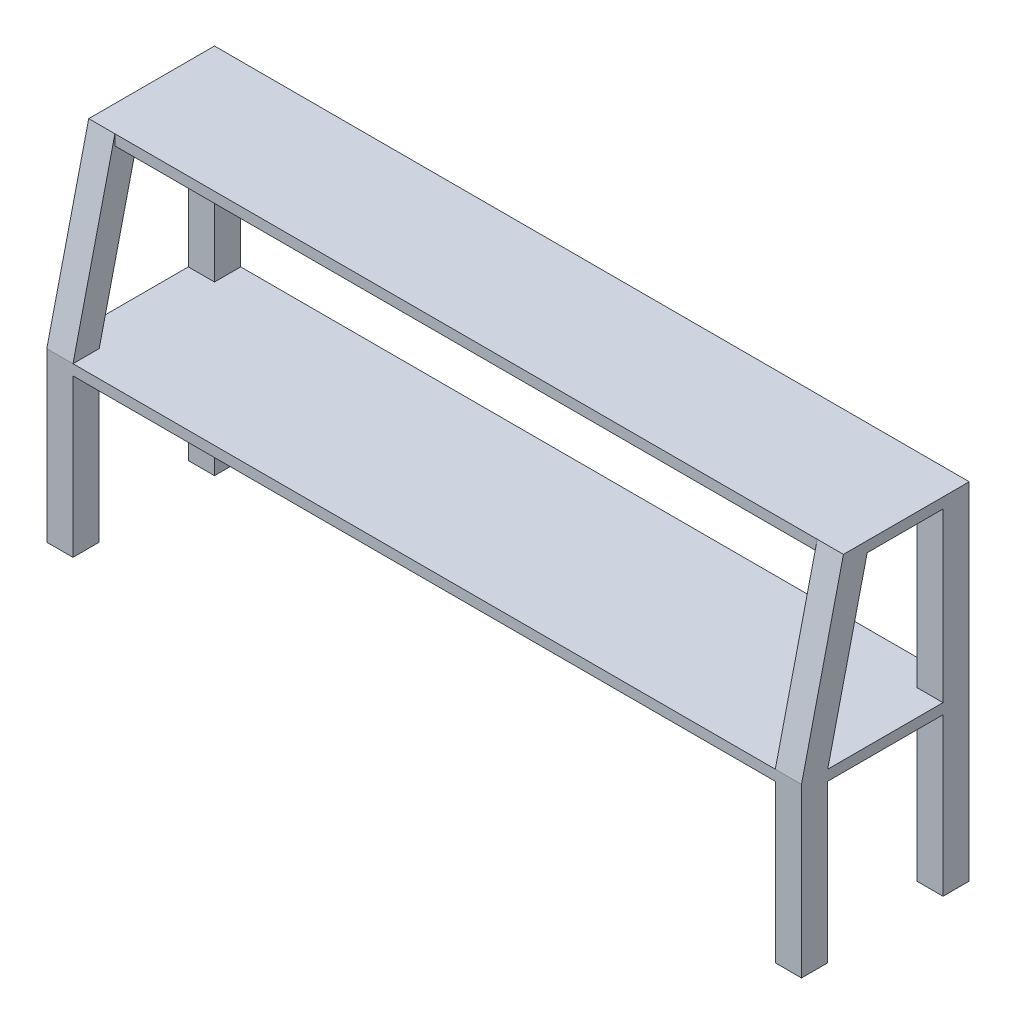
ISO-10303-21;
HEADER;
FILE_DESCRIPTION(('STEP AP214'),'2;1');
FILE_NAME('part.step','',(''),(''),'','','');
FILE_SCHEMA(('AUTOMOTIVE_DESIGN { 1 0 10303 214 1 1 1 1 }'));
ENDSEC;
DATA;
#1=APPLICATION_CONTEXT('core data for automotive mechanical design processes');
#2=APPLICATION_PROTOCOL_DEFINITION('international standard','automotive_design',2000,#1);
#3=PRODUCT_CONTEXT('',#1,'mechanical');
#4=PRODUCT('Part','Part','',(#3));
#5=PRODUCT_RELATED_PRODUCT_CATEGORY('part','',(#4));
#6=PRODUCT_DEFINITION_FORMATION('','',#4);
#7=PRODUCT_DEFINITION_CONTEXT('part definition',#1,'design');
#8=PRODUCT_DEFINITION('design','',#6,#7);
#9=PRODUCT_DEFINITION_SHAPE('','',#8);
#10=(LENGTH_UNIT() NAMED_UNIT(*) SI_UNIT(.MILLI.,.METRE.));
#11=(NAMED_UNIT(*) PLANE_ANGLE_UNIT() SI_UNIT($,.RADIAN.));
#12=(NAMED_UNIT(*) SI_UNIT($,.STERADIAN.) SOLID_ANGLE_UNIT());
#13=UNCERTAINTY_MEASURE_WITH_UNIT(LENGTH_MEASURE(1.E-05),#10,'distance_accuracy_value','');
#14=(GEOMETRIC_REPRESENTATION_CONTEXT(3) GLOBAL_UNCERTAINTY_ASSIGNED_CONTEXT((#13)) GLOBAL_UNIT_ASSIGNED_CONTEXT((#10,
#11,#12)) REPRESENTATION_CONTEXT('',''));
#15=CARTESIAN_POINT('',(0.,0.,0.));
#16=DIRECTION('',(0.,0.,1.));
#17=DIRECTION('',(1.,0.,0.));
#18=AXIS2_PLACEMENT_3D('',#15,#16,#17);
#19=CARTESIAN_POINT('',(0.,12.7,0.));
#20=DIRECTION('',(0.,-1.,0.));
#21=DIRECTION('',(0.,0.,-1.));
#22=AXIS2_PLACEMENT_3D('',#19,#20,#21);
#23=PLANE('',#22);
#24=DIRECTION('',(-1.,0.,0.));
#25=VECTOR('',#24,1.);
#26=CARTESIAN_POINT('',(31.75,12.7,-31.75));
#27=LINE('',#26,#25);
#28=CARTESIAN_POINT('',(31.75,12.7,-31.75));
#29=VERTEX_POINT('',#28);
#30=CARTESIAN_POINT('',(0.,12.7,-31.75));
#31=VERTEX_POINT('',#30);
#32=EDGE_CURVE('E61',#29,#31,#27,.T.);
#33=ORIENTED_EDGE('',*,*,#32,.F.);
#34=DIRECTION('',(0.,0.,1.));
#35=VECTOR('',#34,1.);
#36=CARTESIAN_POINT('',(31.75,12.7,0.));
#37=LINE('',#36,#35);
#38=CARTESIAN_POINT('',(31.75,12.7,0.));
#39=VERTEX_POINT('',#38);
#40=EDGE_CURVE('E254',#29,#39,#37,.T.);
#41=ORIENTED_EDGE('',*,*,#40,.T.);
#42=DIRECTION('',(1.,0.,0.));
#43=VECTOR('',#42,1.);
#44=CARTESIAN_POINT('',(0.,12.7,0.));
#45=LINE('',#44,#43);
#46=CARTESIAN_POINT('',(882.65,12.7,0.));
#47=VERTEX_POINT('',#46);
#48=EDGE_CURVE('E243',#39,#47,#45,.T.);
#49=ORIENTED_EDGE('',*,*,#48,.T.);
#50=DIRECTION('',(0.,0.,-1.));
#51=VECTOR('',#50,1.);
#52=CARTESIAN_POINT('',(882.65,12.7,0.));
#53=LINE('',#52,#51);
#54=CARTESIAN_POINT('',(882.65,12.7,-31.75));
#55=VERTEX_POINT('',#54);
#56=EDGE_CURVE('E456',#47,#55,#53,.T.);
#57=ORIENTED_EDGE('',*,*,#56,.T.);
#58=DIRECTION('',(1.,0.,0.));
#59=VECTOR('',#58,1.);
#60=CARTESIAN_POINT('',(882.65,12.7,-31.75));
#61=LINE('',#60,#59);
#62=CARTESIAN_POINT('',(914.4,12.7,-31.75));
#63=VERTEX_POINT('',#62);
#64=EDGE_CURVE('E410',#55,#63,#61,.T.);
#65=ORIENTED_EDGE('',*,*,#64,.T.);
#66=DIRECTION('',(0.,0.,-1.));
#67=VECTOR('',#66,1.);
#68=CARTESIAN_POINT('',(914.4,12.7,0.));
#69=LINE('',#68,#67);
#70=CARTESIAN_POINT('',(914.4,12.7,-171.45));
#71=VERTEX_POINT('',#70);
#72=EDGE_CURVE('E278',#63,#71,#69,.T.);
#73=ORIENTED_EDGE('',*,*,#72,.T.);
#74=DIRECTION('',(-1.,0.,0.));
#75=VECTOR('',#74,1.);
#76=CARTESIAN_POINT('',(0.,12.7,-171.45));
#77=LINE('',#76,#75);
#78=CARTESIAN_POINT('',(882.65,12.7,-171.45));
#79=VERTEX_POINT('',#78);
#80=EDGE_CURVE('E293',#71,#79,#77,.T.);
#81=ORIENTED_EDGE('',*,*,#80,.T.);
#82=DIRECTION('',(0.,0.,-1.));
#83=VECTOR('',#82,1.);
#84=CARTESIAN_POINT('',(882.65,12.7,0.));
#85=LINE('',#84,#83);
#86=CARTESIAN_POINT('',(882.65,12.7,-203.2));
#87=VERTEX_POINT('',#86);
#88=EDGE_CURVE('E512',#79,#87,#85,.T.);
#89=ORIENTED_EDGE('',*,*,#88,.T.);
#90=DIRECTION('',(-1.,0.,0.));
#91=VECTOR('',#90,1.);
#92=CARTESIAN_POINT('',(0.,12.7,-203.2));
#93=LINE('',#92,#91);
#94=CARTESIAN_POINT('',(31.75,12.7,-203.2));
#95=VERTEX_POINT('',#94);
#96=EDGE_CURVE('E280',#87,#95,#93,.T.);
#97=ORIENTED_EDGE('',*,*,#96,.T.);
#98=DIRECTION('',(0.,0.,1.));
#99=VECTOR('',#98,1.);
#100=CARTESIAN_POINT('',(31.75,12.7,0.));
#101=LINE('',#100,#99);
#102=CARTESIAN_POINT('',(31.75,12.7,-171.45));
#103=VERTEX_POINT('',#102);
#104=EDGE_CURVE('E390',#95,#103,#101,.T.);
#105=ORIENTED_EDGE('',*,*,#104,.T.);
#106=DIRECTION('',(1.,0.,0.));
#107=VECTOR('',#106,1.);
#108=CARTESIAN_POINT('',(0.,12.7,-171.45));
#109=LINE('',#108,#107);
#110=CARTESIAN_POINT('',(0.,12.7,-171.45));
#111=VERTEX_POINT('',#110);
#112=EDGE_CURVE('E356',#111,#103,#109,.T.);
#113=ORIENTED_EDGE('',*,*,#112,.F.);
#114=DIRECTION('',(0.,0.,1.));
#115=VECTOR('',#114,1.);
#116=CARTESIAN_POINT('',(0.,12.7,0.));
#117=LINE('',#116,#115);
#118=EDGE_CURVE('E252',#111,#31,#117,.T.);
#119=ORIENTED_EDGE('',*,*,#118,.T.);
#120=EDGE_LOOP('',(#33,#41,#49,#57,#65,#73,#81,#89,#97,#105,#113,#119));
#121=FACE_BOUND('',#120,.T.);
#122=ADVANCED_FACE('F45',(#121),#23,.F.);
#123=CARTESIAN_POINT('',(0.,0.,0.));
#124=DIRECTION('',(0.,-1.,0.));
#125=DIRECTION('',(0.,0.,-1.));
#126=AXIS2_PLACEMENT_3D('',#123,#124,#125);
#127=PLANE('',#126);
#128=DIRECTION('',(0.,0.,1.));
#129=VECTOR('',#128,1.);
#130=CARTESIAN_POINT('',(31.75,0.,0.));
#131=LINE('',#130,#129);
#132=CARTESIAN_POINT('',(31.75,0.,-31.75));
#133=VERTEX_POINT('',#132);
#134=CARTESIAN_POINT('',(31.75,0.,0.));
#135=VERTEX_POINT('',#134);
#136=EDGE_CURVE('E261',#133,#135,#131,.T.);
#137=ORIENTED_EDGE('',*,*,#136,.F.);
#138=DIRECTION('',(-1.,0.,0.));
#139=VECTOR('',#138,1.);
#140=CARTESIAN_POINT('',(0.,0.,-31.75));
#141=LINE('',#140,#139);
#142=CARTESIAN_POINT('',(0.,0.,-31.75));
#143=VERTEX_POINT('',#142);
#144=EDGE_CURVE('E374',#133,#143,#141,.T.);
#145=ORIENTED_EDGE('',*,*,#144,.T.);
#146=DIRECTION('',(0.,0.,1.));
#147=VECTOR('',#146,1.);
#148=CARTESIAN_POINT('',(0.,0.,0.));
#149=LINE('',#148,#147);
#150=CARTESIAN_POINT('',(0.,0.,-171.45));
#151=VERTEX_POINT('',#150);
#152=EDGE_CURVE('E288',#151,#143,#149,.T.);
#153=ORIENTED_EDGE('',*,*,#152,.F.);
#154=DIRECTION('',(1.,0.,0.));
#155=VECTOR('',#154,1.);
#156=CARTESIAN_POINT('',(0.,0.,-171.45));
#157=LINE('',#156,#155);
#158=CARTESIAN_POINT('',(31.75,0.,-171.45));
#159=VERTEX_POINT('',#158);
#160=EDGE_CURVE('E393',#151,#159,#157,.T.);
#161=ORIENTED_EDGE('',*,*,#160,.T.);
#162=DIRECTION('',(0.,0.,1.));
#163=VECTOR('',#162,1.);
#164=CARTESIAN_POINT('',(31.75,0.,0.));
#165=LINE('',#164,#163);
#166=CARTESIAN_POINT('',(31.75,0.,-203.2));
#167=VERTEX_POINT('',#166);
#168=EDGE_CURVE('E387',#167,#159,#165,.T.);
#169=ORIENTED_EDGE('',*,*,#168,.F.);
#170=DIRECTION('',(-1.,0.,0.));
#171=VECTOR('',#170,1.);
#172=CARTESIAN_POINT('',(0.,0.,-203.2));
#173=LINE('',#172,#171);
#174=CARTESIAN_POINT('',(882.65,0.,-203.2));
#175=VERTEX_POINT('',#174);
#176=EDGE_CURVE('E299',#175,#167,#173,.T.);
#177=ORIENTED_EDGE('',*,*,#176,.F.);
#178=DIRECTION('',(0.,0.,-1.));
#179=VECTOR('',#178,1.);
#180=CARTESIAN_POINT('',(882.65,0.,0.));
#181=LINE('',#180,#179);
#182=CARTESIAN_POINT('',(882.65,0.,-171.45));
#183=VERTEX_POINT('',#182);
#184=EDGE_CURVE('E314',#183,#175,#181,.T.);
#185=ORIENTED_EDGE('',*,*,#184,.F.);
#186=DIRECTION('',(-1.,0.,0.));
#187=VECTOR('',#186,1.);
#188=CARTESIAN_POINT('',(0.,0.,-171.45));
#189=LINE('',#188,#187);
#190=CARTESIAN_POINT('',(914.4,0.,-171.45));
#191=VERTEX_POINT('',#190);
#192=EDGE_CURVE('E317',#191,#183,#189,.T.);
#193=ORIENTED_EDGE('',*,*,#192,.F.);
#194=DIRECTION('',(0.,0.,-1.));
#195=VECTOR('',#194,1.);
#196=CARTESIAN_POINT('',(914.4,0.,0.));
#197=LINE('',#196,#195);
#198=CARTESIAN_POINT('',(914.4,0.,-31.75));
#199=VERTEX_POINT('',#198);
#200=EDGE_CURVE('E296',#199,#191,#197,.T.);
#201=ORIENTED_EDGE('',*,*,#200,.F.);
#202=DIRECTION('',(1.,0.,0.));
#203=VECTOR('',#202,1.);
#204=CARTESIAN_POINT('',(0.,0.,-31.75));
#205=LINE('',#204,#203);
#206=CARTESIAN_POINT('',(882.65,0.,-31.75));
#207=VERTEX_POINT('',#206);
#208=EDGE_CURVE('E331',#207,#199,#205,.T.);
#209=ORIENTED_EDGE('',*,*,#208,.F.);
#210=DIRECTION('',(0.,0.,-1.));
#211=VECTOR('',#210,1.);
#212=CARTESIAN_POINT('',(882.65,0.,0.));
#213=LINE('',#212,#211);
#214=CARTESIAN_POINT('',(882.65,0.,0.));
#215=VERTEX_POINT('',#214);
#216=EDGE_CURVE('E453',#215,#207,#213,.T.);
#217=ORIENTED_EDGE('',*,*,#216,.F.);
#218=DIRECTION('',(1.,0.,0.));
#219=VECTOR('',#218,1.);
#220=CARTESIAN_POINT('',(0.,0.,0.));
#221=LINE('',#220,#219);
#222=EDGE_CURVE('E292',#135,#215,#221,.T.);
#223=ORIENTED_EDGE('',*,*,#222,.F.);
#224=EDGE_LOOP('',(#137,#145,#153,#161,#169,#177,#185,#193,#201,#209,#217,#223));
#225=FACE_BOUND('',#224,.T.);
#226=ADVANCED_FACE('F571',(#225),#127,.T.);
#227=CARTESIAN_POINT('',(0.,215.9,0.));
#228=DIRECTION('',(0.,-1.,0.));
#229=DIRECTION('',(0.,0.,-1.));
#230=AXIS2_PLACEMENT_3D('',#227,#228,#229);
#231=PLANE('',#230);
#232=DIRECTION('',(0.,0.,1.));
#233=VECTOR('',#232,1.);
#234=CARTESIAN_POINT('',(31.75,215.9,0.));
#235=LINE('',#234,#233);
#236=CARTESIAN_POINT('',(31.75,215.9,-79.5617647058823));
#237=VERTEX_POINT('',#236);
#238=CARTESIAN_POINT('',(31.7500000000002,215.9,-50.7999999999999));
#239=VERTEX_POINT('',#238);
#240=EDGE_CURVE('E69',#237,#239,#235,.T.);
#241=ORIENTED_EDGE('',*,*,#240,.F.);
#242=DIRECTION('',(-1.,0.,0.));
#243=VECTOR('',#242,1.);
#244=CARTESIAN_POINT('',(0.,215.9,-79.5617647058823));
#245=LINE('',#244,#243);
#246=CARTESIAN_POINT('',(0.,215.9,-79.5617647058823));
#247=VERTEX_POINT('',#246);
#248=EDGE_CURVE('E260',#237,#247,#245,.T.);
#249=ORIENTED_EDGE('',*,*,#248,.T.);
#250=DIRECTION('',(0.,0.,1.));
#251=VECTOR('',#250,1.);
#252=CARTESIAN_POINT('',(0.,215.9,-203.2));
#253=LINE('',#252,#251);
#254=CARTESIAN_POINT('',(0.,215.9,-171.45));
#255=VERTEX_POINT('',#254);
#256=EDGE_CURVE('E346',#255,#247,#253,.T.);
#257=ORIENTED_EDGE('',*,*,#256,.F.);
#258=DIRECTION('',(1.,0.,0.));
#259=VECTOR('',#258,1.);
#260=CARTESIAN_POINT('',(0.,215.9,-171.45));
#261=LINE('',#260,#259);
#262=CARTESIAN_POINT('',(31.75,215.9,-171.45));
#263=VERTEX_POINT('',#262);
#264=EDGE_CURVE('E54',#255,#263,#261,.T.);
#265=ORIENTED_EDGE('',*,*,#264,.T.);
#266=DIRECTION('',(0.,0.,1.));
#267=VECTOR('',#266,1.);
#268=CARTESIAN_POINT('',(31.75,215.9,0.));
#269=LINE('',#268,#267);
#270=CARTESIAN_POINT('',(31.75,215.9,-203.2));
#271=VERTEX_POINT('',#270);
#272=EDGE_CURVE('E335',#271,#263,#269,.T.);
#273=ORIENTED_EDGE('',*,*,#272,.F.);
#274=DIRECTION('',(-1.,0.,0.));
#275=VECTOR('',#274,1.);
#276=CARTESIAN_POINT('',(914.4,215.9,-203.2));
#277=LINE('',#276,#275);
#278=CARTESIAN_POINT('',(882.65,215.9,-203.2));
#279=VERTEX_POINT('',#278);
#280=EDGE_CURVE('E472',#279,#271,#277,.T.);
#281=ORIENTED_EDGE('',*,*,#280,.F.);
#282=DIRECTION('',(0.,0.,1.));
#283=VECTOR('',#282,1.);
#284=CARTESIAN_POINT('',(882.65,215.9,0.));
#285=LINE('',#284,#283);
#286=CARTESIAN_POINT('',(882.65,215.9,-171.45));
#287=VERTEX_POINT('',#286);
#288=EDGE_CURVE('E320',#279,#287,#285,.T.);
#289=ORIENTED_EDGE('',*,*,#288,.T.);
#290=DIRECTION('',(1.,0.,0.));
#291=VECTOR('',#290,1.);
#292=CARTESIAN_POINT('',(882.65,215.9,-171.45));
#293=LINE('',#292,#291);
#294=CARTESIAN_POINT('',(914.4,215.9,-171.45));
#295=VERTEX_POINT('',#294);
#296=EDGE_CURVE('E469',#287,#295,#293,.T.);
#297=ORIENTED_EDGE('',*,*,#296,.T.);
#298=DIRECTION('',(0.,0.,-1.));
#299=VECTOR('',#298,1.);
#300=CARTESIAN_POINT('',(914.4,215.9,-203.2));
#301=LINE('',#300,#299);
#302=CARTESIAN_POINT('',(914.4,215.9,-79.5617647058824));
#303=VERTEX_POINT('',#302);
#304=EDGE_CURVE('E459',#303,#295,#301,.T.);
#305=ORIENTED_EDGE('',*,*,#304,.F.);
#306=DIRECTION('',(1.,0.,0.));
#307=VECTOR('',#306,1.);
#308=CARTESIAN_POINT('',(0.,215.9,-79.5617647058823));
#309=LINE('',#308,#307);
#310=CARTESIAN_POINT('',(882.65,215.9,-79.5617647058823));
#311=VERTEX_POINT('',#310);
#312=EDGE_CURVE('E327',#311,#303,#309,.T.);
#313=ORIENTED_EDGE('',*,*,#312,.F.);
#314=DIRECTION('',(0.,0.,-1.));
#315=VECTOR('',#314,1.);
#316=CARTESIAN_POINT('',(882.65,215.9,0.));
#317=LINE('',#316,#315);
#318=CARTESIAN_POINT('',(882.65,215.9,-50.7999999999999));
#319=VERTEX_POINT('',#318);
#320=EDGE_CURVE('E324',#319,#311,#317,.T.);
#321=ORIENTED_EDGE('',*,*,#320,.F.);
#322=DIRECTION('',(1.,0.,0.));
#323=VECTOR('',#322,1.);
#324=CARTESIAN_POINT('',(914.4,215.9,-50.8));
#325=LINE('',#324,#323);
#326=EDGE_CURVE('E464',#239,#319,#325,.T.);
#327=ORIENTED_EDGE('',*,*,#326,.F.);
#328=EDGE_LOOP('',(#241,#249,#257,#265,#273,#281,#289,#297,#305,#313,#321,#327));
#329=FACE_BOUND('',#328,.T.);
#330=ADVANCED_FACE('F342',(#329),#231,.T.);
#331=CARTESIAN_POINT('',(0.,12.7,0.));
#332=DIRECTION('',(1.,0.,0.));
#333=DIRECTION('',(0.,0.,-1.));
#334=AXIS2_PLACEMENT_3D('',#331,#332,#333);
#335=PLANE('',#334);
#336=DIRECTION('',(0.,-1.,0.));
#337=VECTOR('',#336,1.);
#338=CARTESIAN_POINT('',(0.,12.7,0.));
#339=LINE('',#338,#337);
#340=CARTESIAN_POINT('',(0.,12.7,0.));
#341=VERTEX_POINT('',#340);
#342=CARTESIAN_POINT('',(0.,-190.5,0.));
#343=VERTEX_POINT('',#342);
#344=EDGE_CURVE('E311',#341,#343,#339,.T.);
#345=ORIENTED_EDGE('',*,*,#344,.F.);
#346=DIRECTION('',(0.,-0.973417168333576,0.229039333725547));
#347=VECTOR('',#346,1.);
#348=CARTESIAN_POINT('',(0.,12.7,0.));
#349=LINE('',#348,#347);
#350=CARTESIAN_POINT('',(0.,228.6,-50.7999999999999));
#351=VERTEX_POINT('',#350);
#352=EDGE_CURVE('E276',#351,#341,#349,.T.);
#353=ORIENTED_EDGE('',*,*,#352,.F.);
#354=DIRECTION('',(0.,0.,1.));
#355=VECTOR('',#354,1.);
#356=CARTESIAN_POINT('',(0.,228.6,-203.2));
#357=LINE('',#356,#355);
#358=CARTESIAN_POINT('',(0.,228.6,-203.2));
#359=VERTEX_POINT('',#358);
#360=EDGE_CURVE('E460',#359,#351,#357,.T.);
#361=ORIENTED_EDGE('',*,*,#360,.F.);
#362=DIRECTION('',(0.,-1.,0.));
#363=VECTOR('',#362,1.);
#364=CARTESIAN_POINT('',(0.,12.7,-203.2));
#365=LINE('',#364,#363);
#366=CARTESIAN_POINT('',(0.,-190.5,-203.2));
#367=VERTEX_POINT('',#366);
#368=EDGE_CURVE('E287',#359,#367,#365,.T.);
#369=ORIENTED_EDGE('',*,*,#368,.T.);
#370=DIRECTION('',(0.,0.,-1.));
#371=VECTOR('',#370,1.);
#372=CARTESIAN_POINT('',(0.,-190.5,0.));
#373=LINE('',#372,#371);
#374=CARTESIAN_POINT('',(0.,-190.5,-171.45));
#375=VERTEX_POINT('',#374);
#376=EDGE_CURVE('E375',#375,#367,#373,.T.);
#377=ORIENTED_EDGE('',*,*,#376,.F.);
#378=DIRECTION('',(0.,-1.,0.));
#379=VECTOR('',#378,1.);
#380=CARTESIAN_POINT('',(0.,12.7,-171.45));
#381=LINE('',#380,#379);
#382=EDGE_CURVE('E371',#151,#375,#381,.T.);
#383=ORIENTED_EDGE('',*,*,#382,.F.);
#384=ORIENTED_EDGE('',*,*,#152,.T.);
#385=DIRECTION('',(0.,1.,0.));
#386=VECTOR('',#385,1.);
#387=CARTESIAN_POINT('',(0.,12.7,-31.75));
#388=LINE('',#387,#386);
#389=CARTESIAN_POINT('',(0.,-190.5,-31.75));
#390=VERTEX_POINT('',#389);
#391=EDGE_CURVE('E580',#390,#143,#388,.T.);
#392=ORIENTED_EDGE('',*,*,#391,.F.);
#393=DIRECTION('',(0.,0.,-1.));
#394=VECTOR('',#393,1.);
#395=CARTESIAN_POINT('',(0.,-190.5,0.));
#396=LINE('',#395,#394);
#397=EDGE_CURVE('E641',#343,#390,#396,.T.);
#398=ORIENTED_EDGE('',*,*,#397,.F.);
#399=EDGE_LOOP('',(#345,#353,#361,#369,#377,#383,#384,#392,#398));
#400=FACE_BOUND('',#399,.T.);
#401=DIRECTION('',(0.,0.973417168333576,-0.229039333725547));
#402=VECTOR('',#401,1.);
#403=CARTESIAN_POINT('',(0.,5.62131147540984,-30.0844262295082));
#404=LINE('',#403,#402);
#405=EDGE_CURVE('E271',#31,#247,#404,.T.);
#406=ORIENTED_EDGE('',*,*,#405,.F.);
#407=ORIENTED_EDGE('',*,*,#118,.F.);
#408=EDGE_CURVE('E352',#255,#111,#381,.T.);
#409=ORIENTED_EDGE('',*,*,#408,.F.);
#410=ORIENTED_EDGE('',*,*,#256,.T.);
#411=EDGE_LOOP('',(#406,#407,#409,#410));
#412=FACE_BOUND('',#411,.T.);
#413=ADVANCED_FACE('F47',(#400,#412),#335,.F.);
#414=CARTESIAN_POINT('',(0.,12.7,0.));
#415=DIRECTION('',(0.,0.,-1.));
#416=DIRECTION('',(-1.,0.,0.));
#417=AXIS2_PLACEMENT_3D('',#414,#415,#416);
#418=PLANE('',#417);
#419=ORIENTED_EDGE('',*,*,#48,.F.);
#420=EDGE_CURVE('E246',#341,#39,#45,.T.);
#421=ORIENTED_EDGE('',*,*,#420,.F.);
#422=ORIENTED_EDGE('',*,*,#344,.T.);
#423=DIRECTION('',(-1.,0.,0.));
#424=VECTOR('',#423,1.);
#425=CARTESIAN_POINT('',(31.75,-190.5,0.));
#426=LINE('',#425,#424);
#427=CARTESIAN_POINT('',(31.75,-190.5,0.));
#428=VERTEX_POINT('',#427);
#429=EDGE_CURVE('E555',#428,#343,#426,.T.);
#430=ORIENTED_EDGE('',*,*,#429,.F.);
#431=DIRECTION('',(0.,-1.,0.));
#432=VECTOR('',#431,1.);
#433=CARTESIAN_POINT('',(31.75,12.7,0.));
#434=LINE('',#433,#432);
#435=EDGE_CURVE('E270',#135,#428,#434,.T.);
#436=ORIENTED_EDGE('',*,*,#435,.F.);
#437=ORIENTED_EDGE('',*,*,#222,.T.);
#438=DIRECTION('',(0.,-1.,0.));
#439=VECTOR('',#438,1.);
#440=CARTESIAN_POINT('',(882.65,12.7,0.));
#441=LINE('',#440,#439);
#442=CARTESIAN_POINT('',(882.65,-190.5,0.));
#443=VERTEX_POINT('',#442);
#444=EDGE_CURVE('E444',#215,#443,#441,.T.);
#445=ORIENTED_EDGE('',*,*,#444,.T.);
#446=DIRECTION('',(1.,0.,0.));
#447=VECTOR('',#446,1.);
#448=CARTESIAN_POINT('',(882.65,-190.5,0.));
#449=LINE('',#448,#447);
#450=CARTESIAN_POINT('',(914.4,-190.5,0.));
#451=VERTEX_POINT('',#450);
#452=EDGE_CURVE('E403',#443,#451,#449,.T.);
#453=ORIENTED_EDGE('',*,*,#452,.T.);
#454=DIRECTION('',(0.,-1.,0.));
#455=VECTOR('',#454,1.);
#456=CARTESIAN_POINT('',(914.4,12.7,0.));
#457=LINE('',#456,#455);
#458=CARTESIAN_POINT('',(914.4,12.7,0.));
#459=VERTEX_POINT('',#458);
#460=EDGE_CURVE('E308',#459,#451,#457,.T.);
#461=ORIENTED_EDGE('',*,*,#460,.F.);
#462=DIRECTION('',(1.,0.,0.));
#463=VECTOR('',#462,1.);
#464=CARTESIAN_POINT('',(882.65,12.7,0.));
#465=LINE('',#464,#463);
#466=EDGE_CURVE('E249',#47,#459,#465,.T.);
#467=ORIENTED_EDGE('',*,*,#466,.F.);
#468=EDGE_LOOP('',(#419,#421,#422,#430,#436,#437,#445,#453,#461,#467));
#469=FACE_BOUND('',#468,.T.);
#470=ADVANCED_FACE('F244',(#469),#418,.F.);
#471=CARTESIAN_POINT('',(914.4,12.7,0.));
#472=DIRECTION('',(-1.,0.,0.));
#473=DIRECTION('',(0.,0.,1.));
#474=AXIS2_PLACEMENT_3D('',#471,#472,#473);
#475=PLANE('',#474);
#476=DIRECTION('',(0.,0.973417168333576,-0.229039333725547));
#477=VECTOR('',#476,1.);
#478=CARTESIAN_POINT('',(914.4,228.6,-82.55));
#479=LINE('',#478,#477);
#480=EDGE_CURVE('E417',#63,#303,#479,.T.);
#481=ORIENTED_EDGE('',*,*,#480,.T.);
#482=ORIENTED_EDGE('',*,*,#304,.T.);
#483=DIRECTION('',(0.,-1.,0.));
#484=VECTOR('',#483,1.);
#485=CARTESIAN_POINT('',(914.4,228.6,-171.45));
#486=LINE('',#485,#484);
#487=EDGE_CURVE('E500',#295,#71,#486,.T.);
#488=ORIENTED_EDGE('',*,*,#487,.T.);
#489=ORIENTED_EDGE('',*,*,#72,.F.);
#490=EDGE_LOOP('',(#481,#482,#488,#489));
#491=FACE_BOUND('',#490,.T.);
#492=DIRECTION('',(0.,0.,1.));
#493=VECTOR('',#492,1.);
#494=CARTESIAN_POINT('',(914.4,228.6,-203.2));
#495=LINE('',#494,#493);
#496=CARTESIAN_POINT('',(914.4,228.6,-203.2));
#497=VERTEX_POINT('',#496);
#498=CARTESIAN_POINT('',(914.4,228.6,-50.8));
#499=VERTEX_POINT('',#498);
#500=EDGE_CURVE('E482',#497,#499,#495,.T.);
#501=ORIENTED_EDGE('',*,*,#500,.T.);
#502=DIRECTION('',(0.,-0.973417168333576,0.229039333725547));
#503=VECTOR('',#502,1.);
#504=CARTESIAN_POINT('',(914.4,12.7,0.));
#505=LINE('',#504,#503);
#506=EDGE_CURVE('E428',#499,#459,#505,.T.);
#507=ORIENTED_EDGE('',*,*,#506,.T.);
#508=ORIENTED_EDGE('',*,*,#460,.T.);
#509=DIRECTION('',(0.,0.,-1.));
#510=VECTOR('',#509,1.);
#511=CARTESIAN_POINT('',(914.4,-190.5,0.));
#512=LINE('',#511,#510);
#513=CARTESIAN_POINT('',(914.4,-190.5,-31.75));
#514=VERTEX_POINT('',#513);
#515=EDGE_CURVE('E424',#451,#514,#512,.T.);
#516=ORIENTED_EDGE('',*,*,#515,.T.);
#517=DIRECTION('',(0.,1.,0.));
#518=VECTOR('',#517,1.);
#519=CARTESIAN_POINT('',(914.4,-190.5,-31.75));
#520=LINE('',#519,#518);
#521=EDGE_CURVE('E420',#514,#199,#520,.T.);
#522=ORIENTED_EDGE('',*,*,#521,.T.);
#523=ORIENTED_EDGE('',*,*,#200,.T.);
#524=CARTESIAN_POINT('',(914.4,-190.5,-171.45));
#525=VERTEX_POINT('',#524);
#526=EDGE_CURVE('E499',#191,#525,#486,.T.);
#527=ORIENTED_EDGE('',*,*,#526,.T.);
#528=DIRECTION('',(0.,0.,-1.));
#529=VECTOR('',#528,1.);
#530=CARTESIAN_POINT('',(914.4,-190.5,-203.2));
#531=LINE('',#530,#529);
#532=CARTESIAN_POINT('',(914.4,-190.5,-203.2));
#533=VERTEX_POINT('',#532);
#534=EDGE_CURVE('E504',#525,#533,#531,.T.);
#535=ORIENTED_EDGE('',*,*,#534,.T.);
#536=DIRECTION('',(0.,-1.,0.));
#537=VECTOR('',#536,1.);
#538=CARTESIAN_POINT('',(914.4,12.7,-203.2));
#539=LINE('',#538,#537);
#540=EDGE_CURVE('E305',#497,#533,#539,.T.);
#541=ORIENTED_EDGE('',*,*,#540,.F.);
#542=EDGE_LOOP('',(#501,#507,#508,#516,#522,#523,#527,#535,#541));
#543=FACE_BOUND('',#542,.T.);
#544=ADVANCED_FACE('F611',(#491,#543),#475,.F.);
#545=CARTESIAN_POINT('',(0.,12.7,-203.2));
#546=DIRECTION('',(0.,0.,1.));
#547=DIRECTION('',(1.,0.,0.));
#548=AXIS2_PLACEMENT_3D('',#545,#546,#547);
#549=PLANE('',#548);
#550=DIRECTION('',(0.,1.,0.));
#551=VECTOR('',#550,1.);
#552=CARTESIAN_POINT('',(31.75,12.7,-203.2));
#553=LINE('',#552,#551);
#554=EDGE_CURVE('E379',#95,#271,#553,.T.);
#555=ORIENTED_EDGE('',*,*,#554,.F.);
#556=ORIENTED_EDGE('',*,*,#96,.F.);
#557=DIRECTION('',(0.,1.,0.));
#558=VECTOR('',#557,1.);
#559=CARTESIAN_POINT('',(882.65,228.6,-203.2));
#560=LINE('',#559,#558);
#561=EDGE_CURVE('E488',#87,#279,#560,.T.);
#562=ORIENTED_EDGE('',*,*,#561,.T.);
#563=ORIENTED_EDGE('',*,*,#280,.T.);
#564=EDGE_LOOP('',(#555,#556,#562,#563));
#565=FACE_BOUND('',#564,.T.);
#566=ORIENTED_EDGE('',*,*,#176,.T.);
#567=CARTESIAN_POINT('',(31.75,-190.5,-203.2));
#568=VERTEX_POINT('',#567);
#569=EDGE_CURVE('E367',#568,#167,#553,.T.);
#570=ORIENTED_EDGE('',*,*,#569,.F.);
#571=DIRECTION('',(-1.,0.,0.));
#572=VECTOR('',#571,1.);
#573=CARTESIAN_POINT('',(31.75,-190.5,-203.2));
#574=LINE('',#573,#572);
#575=EDGE_CURVE('E365',#568,#367,#574,.T.);
#576=ORIENTED_EDGE('',*,*,#575,.T.);
#577=ORIENTED_EDGE('',*,*,#368,.F.);
#578=DIRECTION('',(1.,0.,0.));
#579=VECTOR('',#578,1.);
#580=CARTESIAN_POINT('',(882.65,228.6,-203.2));
#581=LINE('',#580,#579);
#582=EDGE_CURVE('E496',#359,#497,#581,.T.);
#583=ORIENTED_EDGE('',*,*,#582,.T.);
#584=ORIENTED_EDGE('',*,*,#540,.T.);
#585=DIRECTION('',(1.,0.,0.));
#586=VECTOR('',#585,1.);
#587=CARTESIAN_POINT('',(882.65,-190.5,-203.2));
#588=LINE('',#587,#586);
#589=CARTESIAN_POINT('',(882.65,-190.5,-203.2));
#590=VERTEX_POINT('',#589);
#591=EDGE_CURVE('E508',#590,#533,#588,.T.);
#592=ORIENTED_EDGE('',*,*,#591,.F.);
#593=EDGE_CURVE('E483',#590,#175,#560,.T.);
#594=ORIENTED_EDGE('',*,*,#593,.T.);
#595=EDGE_LOOP('',(#566,#570,#576,#577,#583,#584,#592,#594));
#596=FACE_BOUND('',#595,.T.);
#597=ADVANCED_FACE('F593',(#565,#596),#549,.F.);
#598=CARTESIAN_POINT('',(882.65,-190.5,-203.2));
#599=DIRECTION('',(0.,-1.,0.));
#600=DIRECTION('',(0.,0.,-1.));
#601=AXIS2_PLACEMENT_3D('',#598,#599,#600);
#602=PLANE('',#601);
#603=ORIENTED_EDGE('',*,*,#534,.F.);
#604=DIRECTION('',(1.,0.,0.));
#605=VECTOR('',#604,1.);
#606=CARTESIAN_POINT('',(882.65,-190.5,-171.45));
#607=LINE('',#606,#605);
#608=CARTESIAN_POINT('',(882.65,-190.5,-171.45));
#609=VERTEX_POINT('',#608);
#610=EDGE_CURVE('E513',#609,#525,#607,.T.);
#611=ORIENTED_EDGE('',*,*,#610,.F.);
#612=DIRECTION('',(0.,0.,-1.));
#613=VECTOR('',#612,1.);
#614=CARTESIAN_POINT('',(882.65,-190.5,-203.2));
#615=LINE('',#614,#613);
#616=EDGE_CURVE('E492',#609,#590,#615,.T.);
#617=ORIENTED_EDGE('',*,*,#616,.T.);
#618=ORIENTED_EDGE('',*,*,#591,.T.);
#619=EDGE_LOOP('',(#603,#611,#617,#618));
#620=FACE_BOUND('',#619,.T.);
#621=ADVANCED_FACE('F602',(#620),#602,.T.);
#622=CARTESIAN_POINT('',(882.65,0.,0.));
#623=DIRECTION('',(-1.,0.,0.));
#624=DIRECTION('',(0.,0.,1.));
#625=AXIS2_PLACEMENT_3D('',#622,#623,#624);
#626=PLANE('',#625);
#627=DIRECTION('',(0.,-1.,0.));
#628=VECTOR('',#627,1.);
#629=CARTESIAN_POINT('',(882.65,228.6,-171.45));
#630=LINE('',#629,#628);
#631=EDGE_CURVE('E487',#183,#609,#630,.T.);
#632=ORIENTED_EDGE('',*,*,#631,.F.);
#633=ORIENTED_EDGE('',*,*,#184,.T.);
#634=ORIENTED_EDGE('',*,*,#593,.F.);
#635=ORIENTED_EDGE('',*,*,#616,.F.);
#636=EDGE_LOOP('',(#632,#633,#634,#635));
#637=FACE_BOUND('',#636,.T.);
#638=ADVANCED_FACE('F598',(#637),#626,.T.);
#639=CARTESIAN_POINT('',(882.65,228.6,-171.45));
#640=DIRECTION('',(0.,0.,1.));
#641=DIRECTION('',(0.,-1.,0.));
#642=AXIS2_PLACEMENT_3D('',#639,#640,#641);
#643=PLANE('',#642);
#644=ORIENTED_EDGE('',*,*,#526,.F.);
#645=ORIENTED_EDGE('',*,*,#192,.T.);
#646=ORIENTED_EDGE('',*,*,#631,.T.);
#647=ORIENTED_EDGE('',*,*,#610,.T.);
#648=EDGE_LOOP('',(#644,#645,#646,#647));
#649=FACE_BOUND('',#648,.T.);
#650=ADVANCED_FACE('F605',(#649),#643,.T.);
#651=ORIENTED_EDGE('',*,*,#296,.F.);
#652=EDGE_CURVE('E489',#287,#79,#630,.T.);
#653=ORIENTED_EDGE('',*,*,#652,.T.);
#654=ORIENTED_EDGE('',*,*,#80,.F.);
#655=ORIENTED_EDGE('',*,*,#487,.F.);
#656=EDGE_LOOP('',(#651,#653,#654,#655));
#657=FACE_BOUND('',#656,.T.);
#658=ADVANCED_FACE('F669',(#657),#643,.T.);
#659=ORIENTED_EDGE('',*,*,#288,.F.);
#660=ORIENTED_EDGE('',*,*,#561,.F.);
#661=ORIENTED_EDGE('',*,*,#88,.F.);
#662=ORIENTED_EDGE('',*,*,#652,.F.);
#663=EDGE_LOOP('',(#659,#660,#661,#662));
#664=FACE_BOUND('',#663,.T.);
#665=ADVANCED_FACE('F529',(#664),#626,.T.);
#666=CARTESIAN_POINT('',(882.65,228.6,-203.2));
#667=DIRECTION('',(0.,1.,0.));
#668=DIRECTION('',(0.,0.,1.));
#669=AXIS2_PLACEMENT_3D('',#666,#667,#668);
#670=PLANE('',#669);
#671=ORIENTED_EDGE('',*,*,#360,.T.);
#672=DIRECTION('',(1.,0.,0.));
#673=VECTOR('',#672,1.);
#674=CARTESIAN_POINT('',(914.4,228.6,-50.8));
#675=LINE('',#674,#673);
#676=CARTESIAN_POINT('',(31.7500000000002,228.6,-50.7999999999999));
#677=VERTEX_POINT('',#676);
#678=EDGE_CURVE('E465',#351,#677,#675,.T.);
#679=ORIENTED_EDGE('',*,*,#678,.T.);
#680=CARTESIAN_POINT('',(882.65,228.6,-50.8));
#681=VERTEX_POINT('',#680);
#682=EDGE_CURVE('E463',#677,#681,#675,.T.);
#683=ORIENTED_EDGE('',*,*,#682,.T.);
#684=DIRECTION('',(1.,0.,0.));
#685=VECTOR('',#684,1.);
#686=CARTESIAN_POINT('',(882.65,228.6,-50.8));
#687=LINE('',#686,#685);
#688=EDGE_CURVE('E399',#681,#499,#687,.T.);
#689=ORIENTED_EDGE('',*,*,#688,.T.);
#690=ORIENTED_EDGE('',*,*,#500,.F.);
#691=ORIENTED_EDGE('',*,*,#582,.F.);
#692=EDGE_LOOP('',(#671,#679,#683,#689,#690,#691));
#693=FACE_BOUND('',#692,.T.);
#694=ADVANCED_FACE('F539',(#693),#670,.T.);
#695=CARTESIAN_POINT('',(914.4,228.6,-50.8));
#696=DIRECTION('',(0.,0.,-1.));
#697=DIRECTION('',(-1.,0.,0.));
#698=AXIS2_PLACEMENT_3D('',#695,#696,#697);
#699=PLANE('',#698);
#700=ORIENTED_EDGE('',*,*,#682,.F.);
#701=DIRECTION('',(0.,-1.,0.));
#702=VECTOR('',#701,1.);
#703=CARTESIAN_POINT('',(31.7499999999999,228.6,-50.7999999999999));
#704=LINE('',#703,#702);
#705=EDGE_CURVE('E11',#677,#239,#704,.T.);
#706=ORIENTED_EDGE('',*,*,#705,.T.);
#707=ORIENTED_EDGE('',*,*,#326,.T.);
#708=DIRECTION('',(0.,1.,0.));
#709=VECTOR('',#708,1.);
#710=CARTESIAN_POINT('',(882.65,228.6,-50.8));
#711=LINE('',#710,#709);
#712=EDGE_CURVE('E432',#319,#681,#711,.T.);
#713=ORIENTED_EDGE('',*,*,#712,.T.);
#714=EDGE_LOOP('',(#700,#706,#707,#713));
#715=FACE_BOUND('',#714,.T.);
#716=ADVANCED_FACE('F551',(#715),#699,.F.);
#717=CARTESIAN_POINT('',(882.65,0.,0.));
#718=DIRECTION('',(-1.,0.,0.));
#719=DIRECTION('',(0.,0.,1.));
#720=AXIS2_PLACEMENT_3D('',#717,#718,#719);
#721=PLANE('',#720);
#722=ORIENTED_EDGE('',*,*,#56,.F.);
#723=DIRECTION('',(0.,-0.973417168333576,0.229039333725547));
#724=VECTOR('',#723,1.);
#725=CARTESIAN_POINT('',(882.65,12.7,0.));
#726=LINE('',#725,#724);
#727=EDGE_CURVE('E421',#681,#47,#726,.T.);
#728=ORIENTED_EDGE('',*,*,#727,.F.);
#729=ORIENTED_EDGE('',*,*,#712,.F.);
#730=ORIENTED_EDGE('',*,*,#320,.T.);
#731=DIRECTION('',(0.,0.973417168333576,-0.229039333725547));
#732=VECTOR('',#731,1.);
#733=CARTESIAN_POINT('',(882.65,228.6,-82.55));
#734=LINE('',#733,#732);
#735=EDGE_CURVE('E402',#55,#311,#734,.T.);
#736=ORIENTED_EDGE('',*,*,#735,.F.);
#737=EDGE_LOOP('',(#722,#728,#729,#730,#736));
#738=FACE_BOUND('',#737,.T.);
#739=ADVANCED_FACE('F548',(#738),#721,.T.);
#740=CARTESIAN_POINT('',(882.65,228.6,-82.55));
#741=DIRECTION('',(0.,-0.229039333725547,-0.973417168333576));
#742=DIRECTION('',(0.,0.973417168333576,-0.229039333725547));
#743=AXIS2_PLACEMENT_3D('',#740,#741,#742);
#744=PLANE('',#743);
#745=ORIENTED_EDGE('',*,*,#735,.T.);
#746=ORIENTED_EDGE('',*,*,#312,.T.);
#747=ORIENTED_EDGE('',*,*,#480,.F.);
#748=ORIENTED_EDGE('',*,*,#64,.F.);
#749=EDGE_LOOP('',(#745,#746,#747,#748));
#750=FACE_BOUND('',#749,.T.);
#751=ADVANCED_FACE('F674',(#750),#744,.T.);
#752=CARTESIAN_POINT('',(882.65,12.7,0.));
#753=DIRECTION('',(0.,0.229039333725547,0.973417168333576));
#754=DIRECTION('',(0.,-0.973417168333576,0.229039333725547));
#755=AXIS2_PLACEMENT_3D('',#752,#753,#754);
#756=PLANE('',#755);
#757=ORIENTED_EDGE('',*,*,#506,.F.);
#758=ORIENTED_EDGE('',*,*,#688,.F.);
#759=ORIENTED_EDGE('',*,*,#727,.T.);
#760=ORIENTED_EDGE('',*,*,#466,.T.);
#761=EDGE_LOOP('',(#757,#758,#759,#760));
#762=FACE_BOUND('',#761,.T.);
#763=ADVANCED_FACE('F545',(#762),#756,.T.);
#764=ORIENTED_EDGE('',*,*,#444,.F.);
#765=ORIENTED_EDGE('',*,*,#216,.T.);
#766=DIRECTION('',(0.,1.,0.));
#767=VECTOR('',#766,1.);
#768=CARTESIAN_POINT('',(882.65,-190.5,-31.75));
#769=LINE('',#768,#767);
#770=CARTESIAN_POINT('',(882.65,-190.5,-31.75));
#771=VERTEX_POINT('',#770);
#772=EDGE_CURVE('E436',#771,#207,#769,.T.);
#773=ORIENTED_EDGE('',*,*,#772,.F.);
#774=DIRECTION('',(0.,0.,-1.));
#775=VECTOR('',#774,1.);
#776=CARTESIAN_POINT('',(882.65,-190.5,0.));
#777=LINE('',#776,#775);
#778=EDGE_CURVE('E440',#443,#771,#777,.T.);
#779=ORIENTED_EDGE('',*,*,#778,.F.);
#780=EDGE_LOOP('',(#764,#765,#773,#779));
#781=FACE_BOUND('',#780,.T.);
#782=ADVANCED_FACE('F620',(#781),#721,.T.);
#783=CARTESIAN_POINT('',(882.65,-190.5,-31.75));
#784=DIRECTION('',(0.,0.,-1.));
#785=DIRECTION('',(-1.,0.,0.));
#786=AXIS2_PLACEMENT_3D('',#783,#784,#785);
#787=PLANE('',#786);
#788=ORIENTED_EDGE('',*,*,#772,.T.);
#789=ORIENTED_EDGE('',*,*,#208,.T.);
#790=ORIENTED_EDGE('',*,*,#521,.F.);
#791=DIRECTION('',(1.,0.,0.));
#792=VECTOR('',#791,1.);
#793=CARTESIAN_POINT('',(882.65,-190.5,-31.75));
#794=LINE('',#793,#792);
#795=EDGE_CURVE('E407',#771,#514,#794,.T.);
#796=ORIENTED_EDGE('',*,*,#795,.F.);
#797=EDGE_LOOP('',(#788,#789,#790,#796));
#798=FACE_BOUND('',#797,.T.);
#799=ADVANCED_FACE('F615',(#798),#787,.T.);
#800=CARTESIAN_POINT('',(882.65,-190.5,0.));
#801=DIRECTION('',(0.,-1.,0.));
#802=DIRECTION('',(0.,0.,-1.));
#803=AXIS2_PLACEMENT_3D('',#800,#801,#802);
#804=PLANE('',#803);
#805=ORIENTED_EDGE('',*,*,#515,.F.);
#806=ORIENTED_EDGE('',*,*,#452,.F.);
#807=ORIENTED_EDGE('',*,*,#778,.T.);
#808=ORIENTED_EDGE('',*,*,#795,.T.);
#809=EDGE_LOOP('',(#805,#806,#807,#808));
#810=FACE_BOUND('',#809,.T.);
#811=ADVANCED_FACE('F623',(#810),#804,.T.);
#812=CARTESIAN_POINT('',(31.75,0.,0.));
#813=DIRECTION('',(1.,0.,0.));
#814=DIRECTION('',(0.,0.,-1.));
#815=AXIS2_PLACEMENT_3D('',#812,#813,#814);
#816=PLANE('',#815);
#817=ORIENTED_EDGE('',*,*,#104,.F.);
#818=ORIENTED_EDGE('',*,*,#554,.T.);
#819=ORIENTED_EDGE('',*,*,#272,.T.);
#820=DIRECTION('',(0.,-1.,0.));
#821=VECTOR('',#820,1.);
#822=CARTESIAN_POINT('',(31.75,12.7,-171.45));
#823=LINE('',#822,#821);
#824=EDGE_CURVE('E354',#263,#103,#823,.T.);
#825=ORIENTED_EDGE('',*,*,#824,.T.);
#826=EDGE_LOOP('',(#817,#818,#819,#825));
#827=FACE_BOUND('',#826,.T.);
#828=ADVANCED_FACE('F667',(#827),#816,.T.);
#829=CARTESIAN_POINT('',(31.75,12.7,-171.45));
#830=DIRECTION('',(0.,0.,-1.));
#831=DIRECTION('',(0.,1.,0.));
#832=AXIS2_PLACEMENT_3D('',#829,#830,#831);
#833=PLANE('',#832);
#834=ORIENTED_EDGE('',*,*,#408,.T.);
#835=ORIENTED_EDGE('',*,*,#112,.T.);
#836=ORIENTED_EDGE('',*,*,#824,.F.);
#837=ORIENTED_EDGE('',*,*,#264,.F.);
#838=EDGE_LOOP('',(#834,#835,#836,#837));
#839=FACE_BOUND('',#838,.T.);
#840=ADVANCED_FACE('F350',(#839),#833,.F.);
#841=ORIENTED_EDGE('',*,*,#160,.F.);
#842=ORIENTED_EDGE('',*,*,#382,.T.);
#843=DIRECTION('',(-1.,0.,0.));
#844=VECTOR('',#843,1.);
#845=CARTESIAN_POINT('',(31.75,-190.5,-171.45));
#846=LINE('',#845,#844);
#847=CARTESIAN_POINT('',(31.75,-190.5,-171.45));
#848=VERTEX_POINT('',#847);
#849=EDGE_CURVE('E383',#848,#375,#846,.T.);
#850=ORIENTED_EDGE('',*,*,#849,.F.);
#851=EDGE_CURVE('E361',#159,#848,#823,.T.);
#852=ORIENTED_EDGE('',*,*,#851,.F.);
#853=EDGE_LOOP('',(#841,#842,#850,#852));
#854=FACE_BOUND('',#853,.T.);
#855=ADVANCED_FACE('F586',(#854),#833,.F.);
#856=CARTESIAN_POINT('',(31.75,-190.5,0.));
#857=DIRECTION('',(0.,1.,0.));
#858=DIRECTION('',(0.,0.,1.));
#859=AXIS2_PLACEMENT_3D('',#856,#857,#858);
#860=PLANE('',#859);
#861=ORIENTED_EDGE('',*,*,#376,.T.);
#862=ORIENTED_EDGE('',*,*,#575,.F.);
#863=DIRECTION('',(0.,0.,-1.));
#864=VECTOR('',#863,1.);
#865=CARTESIAN_POINT('',(31.75,-190.5,0.));
#866=LINE('',#865,#864);
#867=EDGE_CURVE('E360',#848,#568,#866,.T.);
#868=ORIENTED_EDGE('',*,*,#867,.F.);
#869=ORIENTED_EDGE('',*,*,#849,.T.);
#870=EDGE_LOOP('',(#861,#862,#868,#869));
#871=FACE_BOUND('',#870,.T.);
#872=ADVANCED_FACE('F662',(#871),#860,.F.);
#873=ORIENTED_EDGE('',*,*,#569,.T.);
#874=ORIENTED_EDGE('',*,*,#168,.T.);
#875=ORIENTED_EDGE('',*,*,#851,.T.);
#876=ORIENTED_EDGE('',*,*,#867,.T.);
#877=EDGE_LOOP('',(#873,#874,#875,#876));
#878=FACE_BOUND('',#877,.T.);
#879=ADVANCED_FACE('F663',(#878),#816,.T.);
#880=CARTESIAN_POINT('',(31.75,0.,0.));
#881=DIRECTION('',(1.,0.,0.));
#882=DIRECTION('',(0.,0.,-1.));
#883=AXIS2_PLACEMENT_3D('',#880,#881,#882);
#884=PLANE('',#883);
#885=ORIENTED_EDGE('',*,*,#40,.F.);
#886=DIRECTION('',(0.,0.973417168333576,-0.229039333725547));
#887=VECTOR('',#886,1.);
#888=CARTESIAN_POINT('',(31.75,5.62131147540984,-30.0844262295082));
#889=LINE('',#888,#887);
#890=EDGE_CURVE('E553',#29,#237,#889,.T.);
#891=ORIENTED_EDGE('',*,*,#890,.T.);
#892=ORIENTED_EDGE('',*,*,#240,.T.);
#893=ORIENTED_EDGE('',*,*,#705,.F.);
#894=DIRECTION('',(0.,-0.973417168333576,0.229039333725547));
#895=VECTOR('',#894,1.);
#896=CARTESIAN_POINT('',(31.75,12.7,0.));
#897=LINE('',#896,#895);
#898=EDGE_CURVE('E265',#677,#39,#897,.T.);
#899=ORIENTED_EDGE('',*,*,#898,.T.);
#900=EDGE_LOOP('',(#885,#891,#892,#893,#899));
#901=FACE_BOUND('',#900,.T.);
#902=ADVANCED_FACE('F266',(#901),#884,.T.);
#903=CARTESIAN_POINT('',(31.75,12.7,0.));
#904=DIRECTION('',(0.,-0.229039333725547,-0.973417168333576));
#905=DIRECTION('',(0.,0.973417168333576,-0.229039333725547));
#906=AXIS2_PLACEMENT_3D('',#903,#904,#905);
#907=PLANE('',#906);
#908=ORIENTED_EDGE('',*,*,#352,.T.);
#909=ORIENTED_EDGE('',*,*,#420,.T.);
#910=ORIENTED_EDGE('',*,*,#898,.F.);
#911=ORIENTED_EDGE('',*,*,#678,.F.);
#912=EDGE_LOOP('',(#908,#909,#910,#911));
#913=FACE_BOUND('',#912,.T.);
#914=ADVANCED_FACE('F274',(#913),#907,.F.);
#915=CARTESIAN_POINT('',(31.75,5.62131147540984,-30.0844262295082));
#916=DIRECTION('',(0.,0.229039333725547,0.973417168333576));
#917=DIRECTION('',(0.,-0.973417168333576,0.229039333725547));
#918=AXIS2_PLACEMENT_3D('',#915,#916,#917);
#919=PLANE('',#918);
#920=ORIENTED_EDGE('',*,*,#248,.F.);
#921=ORIENTED_EDGE('',*,*,#890,.F.);
#922=ORIENTED_EDGE('',*,*,#32,.T.);
#923=ORIENTED_EDGE('',*,*,#405,.T.);
#924=EDGE_LOOP('',(#920,#921,#922,#923));
#925=FACE_BOUND('',#924,.T.);
#926=ADVANCED_FACE('F782',(#925),#919,.F.);
#927=CARTESIAN_POINT('',(31.75,-190.5,0.));
#928=DIRECTION('',(0.,1.,0.));
#929=DIRECTION('',(0.,0.,1.));
#930=AXIS2_PLACEMENT_3D('',#927,#928,#929);
#931=PLANE('',#930);
#932=ORIENTED_EDGE('',*,*,#397,.T.);
#933=DIRECTION('',(-1.,0.,0.));
#934=VECTOR('',#933,1.);
#935=CARTESIAN_POINT('',(31.75,-190.5,-31.75));
#936=LINE('',#935,#934);
#937=CARTESIAN_POINT('',(31.75,-190.5,-31.75));
#938=VERTEX_POINT('',#937);
#939=EDGE_CURVE('E561',#938,#390,#936,.T.);
#940=ORIENTED_EDGE('',*,*,#939,.F.);
#941=DIRECTION('',(0.,0.,-1.));
#942=VECTOR('',#941,1.);
#943=CARTESIAN_POINT('',(31.75,-190.5,0.));
#944=LINE('',#943,#942);
#945=EDGE_CURVE('E629',#428,#938,#944,.T.);
#946=ORIENTED_EDGE('',*,*,#945,.F.);
#947=ORIENTED_EDGE('',*,*,#429,.T.);
#948=EDGE_LOOP('',(#932,#940,#946,#947));
#949=FACE_BOUND('',#948,.T.);
#950=ADVANCED_FACE('F655',(#949),#931,.F.);
#951=CARTESIAN_POINT('',(31.75,12.7,-31.75));
#952=DIRECTION('',(0.,0.,1.));
#953=DIRECTION('',(1.,0.,0.));
#954=AXIS2_PLACEMENT_3D('',#951,#952,#953);
#955=PLANE('',#954);
#956=ORIENTED_EDGE('',*,*,#144,.F.);
#957=DIRECTION('',(0.,1.,0.));
#958=VECTOR('',#957,1.);
#959=CARTESIAN_POINT('',(31.75,12.7,-31.75));
#960=LINE('',#959,#958);
#961=EDGE_CURVE('E632',#938,#133,#960,.T.);
#962=ORIENTED_EDGE('',*,*,#961,.F.);
#963=ORIENTED_EDGE('',*,*,#939,.T.);
#964=ORIENTED_EDGE('',*,*,#391,.T.);
#965=EDGE_LOOP('',(#956,#962,#963,#964));
#966=FACE_BOUND('',#965,.T.);
#967=ADVANCED_FACE('F653',(#966),#955,.F.);
#968=ORIENTED_EDGE('',*,*,#961,.T.);
#969=ORIENTED_EDGE('',*,*,#136,.T.);
#970=ORIENTED_EDGE('',*,*,#435,.T.);
#971=ORIENTED_EDGE('',*,*,#945,.T.);
#972=EDGE_LOOP('',(#968,#969,#970,#971));
#973=FACE_BOUND('',#972,.T.);
#974=ADVANCED_FACE('F775',(#973),#884,.T.);
#975=CLOSED_SHELL('',(#122,#226,#330,#413,#470,#544,#597,#621,#638,#650,#658,#665,#694,#716,
#739,#751,#763,#782,#799,#811,#828,#840,#855,#872,#879,#902,#914,#926,#950,#967,#974));
#976=MANIFOLD_SOLID_BREP('B2',#975);
#977=ADVANCED_BREP_SHAPE_REPRESENTATION('',(#18,#976),#14);
#978=SHAPE_DEFINITION_REPRESENTATION(#9,#977);
ENDSEC;
END-ISO-10303-21;
